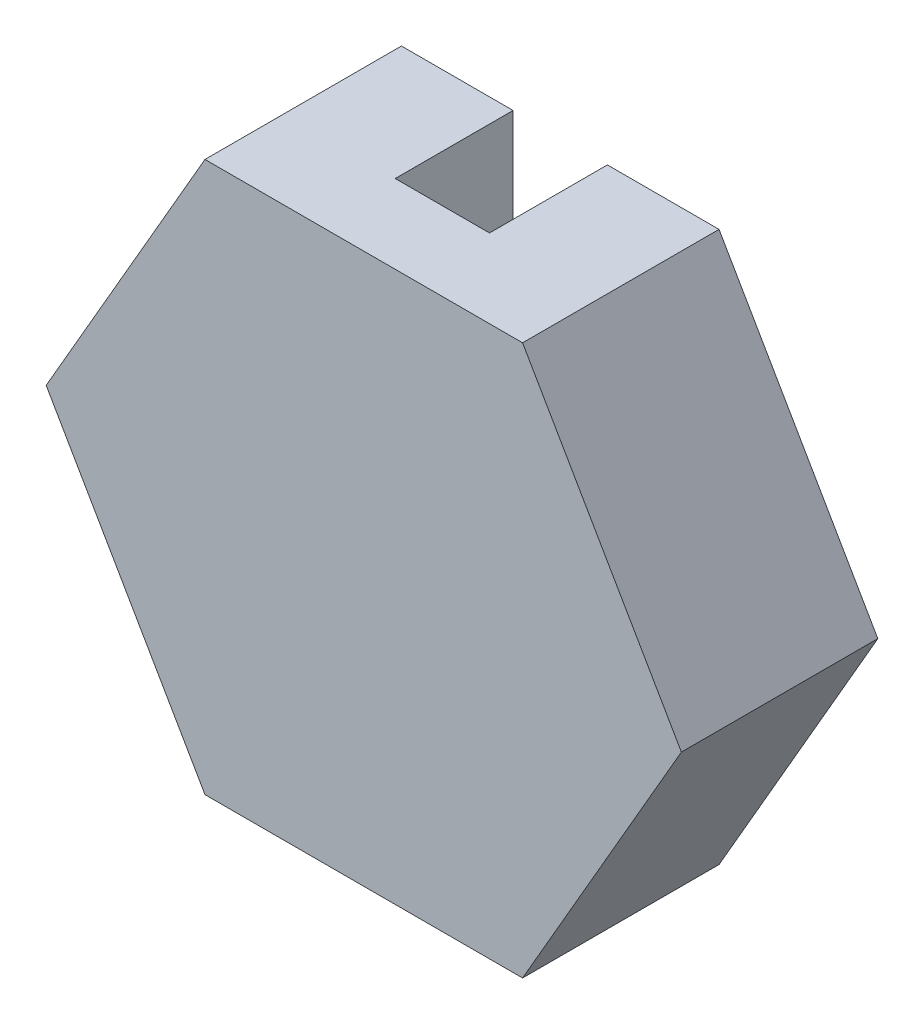
ISO-10303-21;
HEADER;
FILE_DESCRIPTION(('STEP AP214'),'2;1');
FILE_NAME('part.step','',(''),(''),'','','');
FILE_SCHEMA(('AUTOMOTIVE_DESIGN { 1 0 10303 214 1 1 1 1 }'));
ENDSEC;
DATA;
#1=APPLICATION_CONTEXT('core data for automotive mechanical design processes');
#2=APPLICATION_PROTOCOL_DEFINITION('international standard','automotive_design',2000,#1);
#3=PRODUCT_CONTEXT('',#1,'mechanical');
#4=PRODUCT('Part','Part','',(#3));
#5=PRODUCT_RELATED_PRODUCT_CATEGORY('part','',(#4));
#6=PRODUCT_DEFINITION_FORMATION('','',#4);
#7=PRODUCT_DEFINITION_CONTEXT('part definition',#1,'design');
#8=PRODUCT_DEFINITION('design','',#6,#7);
#9=PRODUCT_DEFINITION_SHAPE('','',#8);
#10=(LENGTH_UNIT() NAMED_UNIT(*) SI_UNIT(.MILLI.,.METRE.));
#11=(NAMED_UNIT(*) PLANE_ANGLE_UNIT() SI_UNIT($,.RADIAN.));
#12=(NAMED_UNIT(*) SI_UNIT($,.STERADIAN.) SOLID_ANGLE_UNIT());
#13=UNCERTAINTY_MEASURE_WITH_UNIT(LENGTH_MEASURE(1.E-05),#10,'distance_accuracy_value','');
#14=(GEOMETRIC_REPRESENTATION_CONTEXT(3) GLOBAL_UNCERTAINTY_ASSIGNED_CONTEXT((#13)) GLOBAL_UNIT_ASSIGNED_CONTEXT((#10,
#11,#12)) REPRESENTATION_CONTEXT('',''));
#15=CARTESIAN_POINT('',(0.,0.,0.));
#16=DIRECTION('',(0.,0.,1.));
#17=DIRECTION('',(1.,0.,0.));
#18=AXIS2_PLACEMENT_3D('',#15,#16,#17);
#19=CARTESIAN_POINT('',(-0.6,-3.5,1.5));
#20=DIRECTION('',(0.,0.,1.));
#21=DIRECTION('',(1.,0.,0.));
#22=AXIS2_PLACEMENT_3D('',#19,#20,#21);
#23=PLANE('',#22);
#24=DIRECTION('',(0.,1.,0.));
#25=VECTOR('',#24,1.);
#26=CARTESIAN_POINT('',(0.6,-3.5,1.5));
#27=LINE('',#26,#25);
#28=CARTESIAN_POINT('',(0.6,3.5,1.5));
#29=VERTEX_POINT('',#28);
#30=CARTESIAN_POINT('',(0.6,-3.5,1.5));
#31=VERTEX_POINT('',#30);
#32=EDGE_CURVE('E99',#29,#31,#27,.F.);
#33=ORIENTED_EDGE('',*,*,#32,.T.);
#34=DIRECTION('',(1.,0.,0.));
#35=VECTOR('',#34,1.);
#36=CARTESIAN_POINT('',(-0.6,-3.5,1.5));
#37=LINE('',#36,#35);
#38=CARTESIAN_POINT('',(-0.6,-3.5,1.5));
#39=VERTEX_POINT('',#38);
#40=EDGE_CURVE('E20',#39,#31,#37,.T.);
#41=ORIENTED_EDGE('',*,*,#40,.F.);
#42=DIRECTION('',(0.,-1.,0.));
#43=VECTOR('',#42,1.);
#44=CARTESIAN_POINT('',(-0.6,-3.5,1.5));
#45=LINE('',#44,#43);
#46=CARTESIAN_POINT('',(-0.6,3.5,1.5));
#47=VERTEX_POINT('',#46);
#48=EDGE_CURVE('E97',#39,#47,#45,.F.);
#49=ORIENTED_EDGE('',*,*,#48,.T.);
#50=DIRECTION('',(1.,0.,0.));
#51=VECTOR('',#50,1.);
#52=CARTESIAN_POINT('',(-0.6,3.5,1.5));
#53=LINE('',#52,#51);
#54=EDGE_CURVE('E90',#29,#47,#53,.F.);
#55=ORIENTED_EDGE('',*,*,#54,.F.);
#56=EDGE_LOOP('',(#33,#41,#49,#55));
#57=FACE_BOUND('',#56,.T.);
#58=ADVANCED_FACE('F17',(#57),#23,.F.);
#59=CARTESIAN_POINT('',(-0.6,-3.5,0.));
#60=DIRECTION('',(-1.,0.,0.));
#61=DIRECTION('',(0.,-1.,0.));
#62=AXIS2_PLACEMENT_3D('',#59,#60,#61);
#63=PLANE('',#62);
#64=ORIENTED_EDGE('',*,*,#48,.F.);
#65=DIRECTION('',(0.,0.,1.));
#66=VECTOR('',#65,1.);
#67=CARTESIAN_POINT('',(-0.6,-3.5,0.));
#68=LINE('',#67,#66);
#69=CARTESIAN_POINT('',(-0.6,-3.5,0.));
#70=VERTEX_POINT('',#69);
#71=EDGE_CURVE('E106',#70,#39,#68,.T.);
#72=ORIENTED_EDGE('',*,*,#71,.F.);
#73=DIRECTION('',(0.,1.,0.));
#74=VECTOR('',#73,1.);
#75=CARTESIAN_POINT('',(-0.6,0.,0.));
#76=LINE('',#75,#74);
#77=CARTESIAN_POINT('',(-0.6,3.5,0.));
#78=VERTEX_POINT('',#77);
#79=EDGE_CURVE('E122',#78,#70,#76,.F.);
#80=ORIENTED_EDGE('',*,*,#79,.F.);
#81=DIRECTION('',(0.,0.,1.));
#82=VECTOR('',#81,1.);
#83=CARTESIAN_POINT('',(-0.6,3.5,0.));
#84=LINE('',#83,#82);
#85=EDGE_CURVE('E108',#47,#78,#84,.F.);
#86=ORIENTED_EDGE('',*,*,#85,.F.);
#87=EDGE_LOOP('',(#64,#72,#80,#86));
#88=FACE_BOUND('',#87,.T.);
#89=ADVANCED_FACE('F104',(#88),#63,.F.);
#90=CARTESIAN_POINT('',(0.6,-3.5,0.));
#91=DIRECTION('',(1.,0.,0.));
#92=DIRECTION('',(0.,1.,0.));
#93=AXIS2_PLACEMENT_3D('',#90,#91,#92);
#94=PLANE('',#93);
#95=DIRECTION('',(0.,1.,0.));
#96=VECTOR('',#95,1.);
#97=CARTESIAN_POINT('',(0.6,0.,0.));
#98=LINE('',#97,#96);
#99=CARTESIAN_POINT('',(0.6,-3.5,0.));
#100=VERTEX_POINT('',#99);
#101=CARTESIAN_POINT('',(0.6,3.5,0.));
#102=VERTEX_POINT('',#101);
#103=EDGE_CURVE('E127',#100,#102,#98,.T.);
#104=ORIENTED_EDGE('',*,*,#103,.F.);
#105=DIRECTION('',(0.,0.,1.));
#106=VECTOR('',#105,1.);
#107=CARTESIAN_POINT('',(0.6,-3.5,0.));
#108=LINE('',#107,#106);
#109=EDGE_CURVE('E118',#31,#100,#108,.F.);
#110=ORIENTED_EDGE('',*,*,#109,.F.);
#111=ORIENTED_EDGE('',*,*,#32,.F.);
#112=DIRECTION('',(0.,0.,1.));
#113=VECTOR('',#112,1.);
#114=CARTESIAN_POINT('',(0.6,3.5,0.));
#115=LINE('',#114,#113);
#116=EDGE_CURVE('E120',#102,#29,#115,.T.);
#117=ORIENTED_EDGE('',*,*,#116,.F.);
#118=EDGE_LOOP('',(#104,#110,#111,#117));
#119=FACE_BOUND('',#118,.T.);
#120=ADVANCED_FACE('F219',(#119),#94,.F.);
#121=CARTESIAN_POINT('',(4.04145188432739,0.,0.));
#122=DIRECTION('',(0.,0.,-1.));
#123=DIRECTION('',(-1.,0.,0.));
#124=AXIS2_PLACEMENT_3D('',#121,#122,#123);
#125=PLANE('',#124);
#126=DIRECTION('',(0.5,0.866025403784439,0.));
#127=VECTOR('',#126,1.);
#128=CARTESIAN_POINT('',(-2.02072594216369,3.5,0.));
#129=LINE('',#128,#127);
#130=CARTESIAN_POINT('',(-4.04145188432739,0.,0.));
#131=VERTEX_POINT('',#130);
#132=CARTESIAN_POINT('',(-2.02072594216369,3.5,0.));
#133=VERTEX_POINT('',#132);
#134=EDGE_CURVE('E146',#131,#133,#129,.T.);
#135=ORIENTED_EDGE('',*,*,#134,.T.);
#136=DIRECTION('',(-1.,0.,0.));
#137=VECTOR('',#136,1.);
#138=CARTESIAN_POINT('',(4.04145188432739,3.5,0.));
#139=LINE('',#138,#137);
#140=EDGE_CURVE('E124',#133,#78,#139,.F.);
#141=ORIENTED_EDGE('',*,*,#140,.T.);
#142=ORIENTED_EDGE('',*,*,#79,.T.);
#143=DIRECTION('',(-1.,0.,0.));
#144=VECTOR('',#143,1.);
#145=CARTESIAN_POINT('',(-2.02072594216369,-3.5,0.));
#146=LINE('',#145,#144);
#147=CARTESIAN_POINT('',(-2.02072594216369,-3.5,0.));
#148=VERTEX_POINT('',#147);
#149=EDGE_CURVE('E113',#70,#148,#146,.T.);
#150=ORIENTED_EDGE('',*,*,#149,.T.);
#151=DIRECTION('',(-0.5,0.866025403784439,0.));
#152=VECTOR('',#151,1.);
#153=CARTESIAN_POINT('',(-4.04145188432739,0.,0.));
#154=LINE('',#153,#152);
#155=EDGE_CURVE('E141',#148,#131,#154,.T.);
#156=ORIENTED_EDGE('',*,*,#155,.T.);
#157=EDGE_LOOP('',(#135,#141,#142,#150,#156));
#158=FACE_BOUND('',#157,.T.);
#159=ADVANCED_FACE('F215',(#158),#125,.T.);
#160=CARTESIAN_POINT('',(4.04145188432739,0.,0.));
#161=DIRECTION('',(0.,0.,-1.));
#162=DIRECTION('',(-1.,0.,0.));
#163=AXIS2_PLACEMENT_3D('',#160,#161,#162);
#164=PLANE('',#163);
#165=DIRECTION('',(-0.5,-0.866025403784439,0.));
#166=VECTOR('',#165,1.);
#167=CARTESIAN_POINT('',(2.02072594216369,-3.5,0.));
#168=LINE('',#167,#166);
#169=CARTESIAN_POINT('',(4.04145188432739,0.,0.));
#170=VERTEX_POINT('',#169);
#171=CARTESIAN_POINT('',(2.02072594216369,-3.5,0.));
#172=VERTEX_POINT('',#171);
#173=EDGE_CURVE('E130',#170,#172,#168,.T.);
#174=ORIENTED_EDGE('',*,*,#173,.T.);
#175=DIRECTION('',(-1.,0.,0.));
#176=VECTOR('',#175,1.);
#177=CARTESIAN_POINT('',(-2.02072594216369,-3.5,0.));
#178=LINE('',#177,#176);
#179=EDGE_CURVE('E135',#172,#100,#178,.T.);
#180=ORIENTED_EDGE('',*,*,#179,.T.);
#181=ORIENTED_EDGE('',*,*,#103,.T.);
#182=DIRECTION('',(1.,0.,0.));
#183=VECTOR('',#182,1.);
#184=CARTESIAN_POINT('',(2.02072594216369,3.5,0.));
#185=LINE('',#184,#183);
#186=CARTESIAN_POINT('',(2.02072594216369,3.5,0.));
#187=VERTEX_POINT('',#186);
#188=EDGE_CURVE('E149',#102,#187,#185,.T.);
#189=ORIENTED_EDGE('',*,*,#188,.T.);
#190=DIRECTION('',(0.5,-0.866025403784439,0.));
#191=VECTOR('',#190,1.);
#192=CARTESIAN_POINT('',(4.04145188432739,0.,0.));
#193=LINE('',#192,#191);
#194=EDGE_CURVE('E158',#187,#170,#193,.T.);
#195=ORIENTED_EDGE('',*,*,#194,.T.);
#196=EDGE_LOOP('',(#174,#180,#181,#189,#195));
#197=FACE_BOUND('',#196,.T.);
#198=ADVANCED_FACE('F212',(#197),#164,.T.);
#199=CARTESIAN_POINT('',(2.02072594216369,-3.5,2.5));
#200=DIRECTION('',(-0.866025403784439,0.5,0.));
#201=DIRECTION('',(-0.5,-0.866025403784439,0.));
#202=AXIS2_PLACEMENT_3D('',#199,#200,#201);
#203=PLANE('',#202);
#204=DIRECTION('',(0.,0.,1.));
#205=VECTOR('',#204,1.);
#206=CARTESIAN_POINT('',(4.04145188432739,0.,2.5));
#207=LINE('',#206,#205);
#208=CARTESIAN_POINT('',(4.04145188432739,0.,2.5));
#209=VERTEX_POINT('',#208);
#210=EDGE_CURVE('E154',#170,#209,#207,.T.);
#211=ORIENTED_EDGE('',*,*,#210,.T.);
#212=DIRECTION('',(-0.5,-0.866025403784438,0.));
#213=VECTOR('',#212,1.);
#214=CARTESIAN_POINT('',(4.04145188432739,0.,2.5));
#215=LINE('',#214,#213);
#216=CARTESIAN_POINT('',(2.02072594216369,-3.5,2.5));
#217=VERTEX_POINT('',#216);
#218=EDGE_CURVE('E161',#209,#217,#215,.T.);
#219=ORIENTED_EDGE('',*,*,#218,.T.);
#220=DIRECTION('',(0.,0.,1.));
#221=VECTOR('',#220,1.);
#222=CARTESIAN_POINT('',(2.02072594216369,-3.5,2.5));
#223=LINE('',#222,#221);
#224=EDGE_CURVE('E132',#217,#172,#223,.F.);
#225=ORIENTED_EDGE('',*,*,#224,.T.);
#226=ORIENTED_EDGE('',*,*,#173,.F.);
#227=EDGE_LOOP('',(#211,#219,#225,#226));
#228=FACE_BOUND('',#227,.T.);
#229=ADVANCED_FACE('F190',(#228),#203,.F.);
#230=CARTESIAN_POINT('',(-2.02072594216369,-3.5,2.5));
#231=DIRECTION('',(0.,1.,0.));
#232=DIRECTION('',(-1.,0.,0.));
#233=AXIS2_PLACEMENT_3D('',#230,#231,#232);
#234=PLANE('',#233);
#235=ORIENTED_EDGE('',*,*,#71,.T.);
#236=ORIENTED_EDGE('',*,*,#40,.T.);
#237=ORIENTED_EDGE('',*,*,#109,.T.);
#238=ORIENTED_EDGE('',*,*,#179,.F.);
#239=ORIENTED_EDGE('',*,*,#224,.F.);
#240=DIRECTION('',(-1.,0.,0.));
#241=VECTOR('',#240,1.);
#242=CARTESIAN_POINT('',(4.04145188432739,-3.5,2.5));
#243=LINE('',#242,#241);
#244=CARTESIAN_POINT('',(-2.02072594216369,-3.5,2.5));
#245=VERTEX_POINT('',#244);
#246=EDGE_CURVE('E164',#217,#245,#243,.T.);
#247=ORIENTED_EDGE('',*,*,#246,.T.);
#248=DIRECTION('',(0.,0.,1.));
#249=VECTOR('',#248,1.);
#250=CARTESIAN_POINT('',(-2.02072594216369,-3.5,2.5));
#251=LINE('',#250,#249);
#252=EDGE_CURVE('E139',#245,#148,#251,.F.);
#253=ORIENTED_EDGE('',*,*,#252,.T.);
#254=ORIENTED_EDGE('',*,*,#149,.F.);
#255=EDGE_LOOP('',(#235,#236,#237,#238,#239,#247,#253,#254));
#256=FACE_BOUND('',#255,.T.);
#257=ADVANCED_FACE('F111',(#256),#234,.F.);
#258=CARTESIAN_POINT('',(-4.04145188432739,0.,2.5));
#259=DIRECTION('',(0.866025403784439,0.5,0.));
#260=DIRECTION('',(-0.5,0.866025403784439,0.));
#261=AXIS2_PLACEMENT_3D('',#258,#259,#260);
#262=PLANE('',#261);
#263=ORIENTED_EDGE('',*,*,#252,.F.);
#264=DIRECTION('',(-0.5,0.866025403784439,0.));
#265=VECTOR('',#264,1.);
#266=CARTESIAN_POINT('',(-2.02072594216369,-3.5,2.5));
#267=LINE('',#266,#265);
#268=CARTESIAN_POINT('',(-4.04145188432739,0.,2.5));
#269=VERTEX_POINT('',#268);
#270=EDGE_CURVE('E167',#245,#269,#267,.T.);
#271=ORIENTED_EDGE('',*,*,#270,.T.);
#272=DIRECTION('',(0.,0.,1.));
#273=VECTOR('',#272,1.);
#274=CARTESIAN_POINT('',(-4.04145188432739,0.,2.5));
#275=LINE('',#274,#273);
#276=EDGE_CURVE('E143',#269,#131,#275,.F.);
#277=ORIENTED_EDGE('',*,*,#276,.T.);
#278=ORIENTED_EDGE('',*,*,#155,.F.);
#279=EDGE_LOOP('',(#263,#271,#277,#278));
#280=FACE_BOUND('',#279,.T.);
#281=ADVANCED_FACE('F186',(#280),#262,.F.);
#282=CARTESIAN_POINT('',(-2.02072594216369,3.5,2.5));
#283=DIRECTION('',(0.866025403784439,-0.5,0.));
#284=DIRECTION('',(0.5,0.866025403784439,0.));
#285=AXIS2_PLACEMENT_3D('',#282,#283,#284);
#286=PLANE('',#285);
#287=ORIENTED_EDGE('',*,*,#276,.F.);
#288=DIRECTION('',(0.5,0.866025403784439,0.));
#289=VECTOR('',#288,1.);
#290=CARTESIAN_POINT('',(-4.04145188432739,0.,2.5));
#291=LINE('',#290,#289);
#292=CARTESIAN_POINT('',(-2.02072594216369,3.5,2.5));
#293=VERTEX_POINT('',#292);
#294=EDGE_CURVE('E170',#269,#293,#291,.T.);
#295=ORIENTED_EDGE('',*,*,#294,.T.);
#296=DIRECTION('',(0.,0.,1.));
#297=VECTOR('',#296,1.);
#298=CARTESIAN_POINT('',(-2.02072594216369,3.5,2.5));
#299=LINE('',#298,#297);
#300=EDGE_CURVE('E151',#293,#133,#299,.F.);
#301=ORIENTED_EDGE('',*,*,#300,.T.);
#302=ORIENTED_EDGE('',*,*,#134,.F.);
#303=EDGE_LOOP('',(#287,#295,#301,#302));
#304=FACE_BOUND('',#303,.T.);
#305=ADVANCED_FACE('F182',(#304),#286,.F.);
#306=CARTESIAN_POINT('',(2.02072594216369,3.5,2.5));
#307=DIRECTION('',(0.,-1.,0.));
#308=DIRECTION('',(1.,0.,0.));
#309=AXIS2_PLACEMENT_3D('',#306,#307,#308);
#310=PLANE('',#309);
#311=ORIENTED_EDGE('',*,*,#85,.T.);
#312=ORIENTED_EDGE('',*,*,#140,.F.);
#313=ORIENTED_EDGE('',*,*,#300,.F.);
#314=DIRECTION('',(-1.,0.,0.));
#315=VECTOR('',#314,1.);
#316=CARTESIAN_POINT('',(4.04145188432739,3.5,2.5));
#317=LINE('',#316,#315);
#318=CARTESIAN_POINT('',(2.02072594216369,3.5,2.5));
#319=VERTEX_POINT('',#318);
#320=EDGE_CURVE('E26',#293,#319,#317,.F.);
#321=ORIENTED_EDGE('',*,*,#320,.T.);
#322=DIRECTION('',(0.,0.,1.));
#323=VECTOR('',#322,1.);
#324=CARTESIAN_POINT('',(2.02072594216369,3.5,2.5));
#325=LINE('',#324,#323);
#326=EDGE_CURVE('E34',#319,#187,#325,.F.);
#327=ORIENTED_EDGE('',*,*,#326,.T.);
#328=ORIENTED_EDGE('',*,*,#188,.F.);
#329=ORIENTED_EDGE('',*,*,#116,.T.);
#330=ORIENTED_EDGE('',*,*,#54,.T.);
#331=EDGE_LOOP('',(#311,#312,#313,#321,#327,#328,#329,#330));
#332=FACE_BOUND('',#331,.T.);
#333=ADVANCED_FACE('F175',(#332),#310,.F.);
#334=CARTESIAN_POINT('',(4.04145188432739,0.,2.5));
#335=DIRECTION('',(-0.866025403784439,-0.5,0.));
#336=DIRECTION('',(0.5,-0.866025403784439,0.));
#337=AXIS2_PLACEMENT_3D('',#334,#335,#336);
#338=PLANE('',#337);
#339=ORIENTED_EDGE('',*,*,#326,.F.);
#340=DIRECTION('',(0.5,-0.866025403784439,0.));
#341=VECTOR('',#340,1.);
#342=CARTESIAN_POINT('',(2.02072594216369,3.5,2.5));
#343=LINE('',#342,#341);
#344=EDGE_CURVE('E11',#319,#209,#343,.T.);
#345=ORIENTED_EDGE('',*,*,#344,.T.);
#346=ORIENTED_EDGE('',*,*,#210,.F.);
#347=ORIENTED_EDGE('',*,*,#194,.F.);
#348=EDGE_LOOP('',(#339,#345,#346,#347));
#349=FACE_BOUND('',#348,.T.);
#350=ADVANCED_FACE('F192',(#349),#338,.F.);
#351=CARTESIAN_POINT('',(4.04145188432739,0.,2.5));
#352=DIRECTION('',(0.,0.,-1.));
#353=DIRECTION('',(-1.,0.,0.));
#354=AXIS2_PLACEMENT_3D('',#351,#352,#353);
#355=PLANE('',#354);
#356=ORIENTED_EDGE('',*,*,#320,.F.);
#357=ORIENTED_EDGE('',*,*,#294,.F.);
#358=ORIENTED_EDGE('',*,*,#270,.F.);
#359=ORIENTED_EDGE('',*,*,#246,.F.);
#360=ORIENTED_EDGE('',*,*,#218,.F.);
#361=ORIENTED_EDGE('',*,*,#344,.F.);
#362=EDGE_LOOP('',(#356,#357,#358,#359,#360,#361));
#363=FACE_BOUND('',#362,.T.);
#364=ADVANCED_FACE('F179',(#363),#355,.F.);
#365=CLOSED_SHELL('',(#58,#89,#120,#159,#198,#229,#257,#281,#305,#333,#350,#364));
#366=MANIFOLD_SOLID_BREP('B1',#365);
#367=ADVANCED_BREP_SHAPE_REPRESENTATION('',(#18,#366),#14);
#368=SHAPE_DEFINITION_REPRESENTATION(#9,#367);
ENDSEC;
END-ISO-10303-21;
